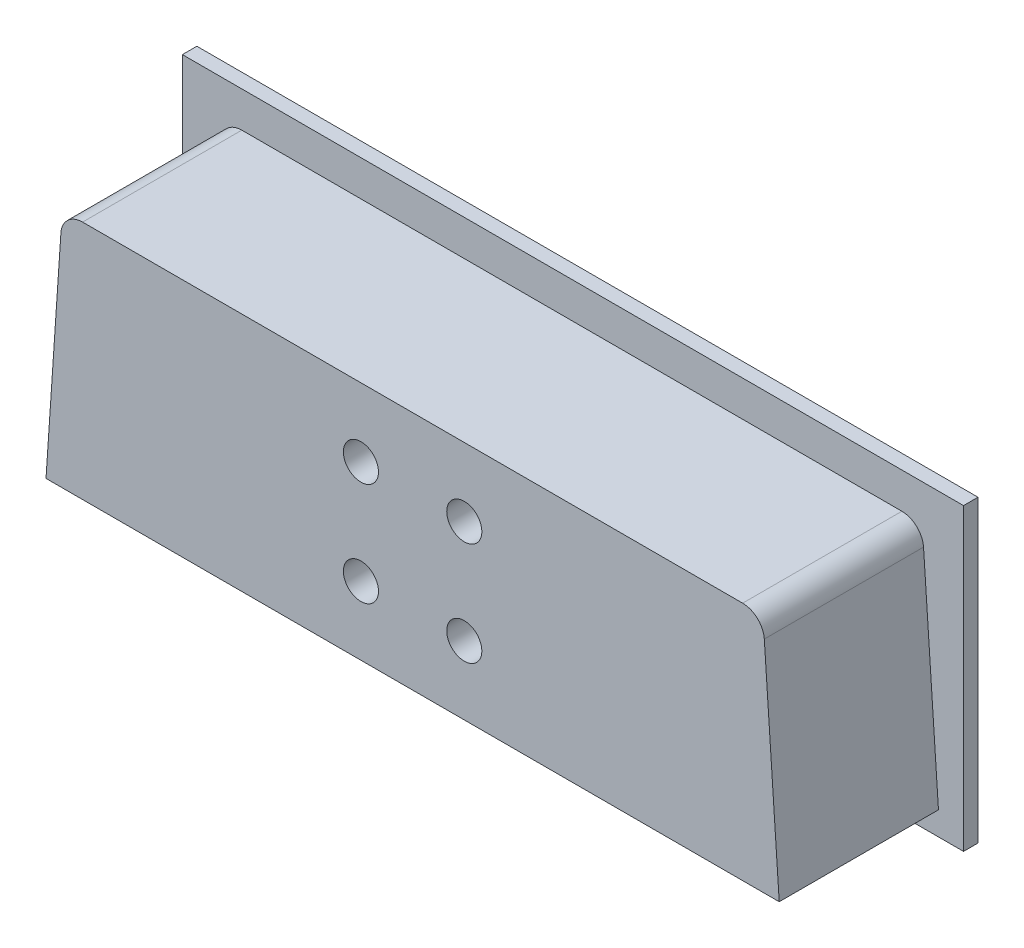
ISO-10303-21;
HEADER;
FILE_DESCRIPTION(('STEP AP214'),'2;1');
FILE_NAME('part.step','',(''),(''),'','','');
FILE_SCHEMA(('AUTOMOTIVE_DESIGN { 1 0 10303 214 1 1 1 1 }'));
ENDSEC;
DATA;
#1=APPLICATION_CONTEXT('core data for automotive mechanical design processes');
#2=APPLICATION_PROTOCOL_DEFINITION('international standard','automotive_design',2000,#1);
#3=PRODUCT_CONTEXT('',#1,'mechanical');
#4=PRODUCT('Part','Part','',(#3));
#5=PRODUCT_RELATED_PRODUCT_CATEGORY('part','',(#4));
#6=PRODUCT_DEFINITION_FORMATION('','',#4);
#7=PRODUCT_DEFINITION_CONTEXT('part definition',#1,'design');
#8=PRODUCT_DEFINITION('design','',#6,#7);
#9=PRODUCT_DEFINITION_SHAPE('','',#8);
#10=(LENGTH_UNIT() NAMED_UNIT(*) SI_UNIT(.MILLI.,.METRE.));
#11=(NAMED_UNIT(*) PLANE_ANGLE_UNIT() SI_UNIT($,.RADIAN.));
#12=(NAMED_UNIT(*) SI_UNIT($,.STERADIAN.) SOLID_ANGLE_UNIT());
#13=UNCERTAINTY_MEASURE_WITH_UNIT(LENGTH_MEASURE(1.E-05),#10,'distance_accuracy_value','');
#14=(GEOMETRIC_REPRESENTATION_CONTEXT(3) GLOBAL_UNCERTAINTY_ASSIGNED_CONTEXT((#13)) GLOBAL_UNIT_ASSIGNED_CONTEXT((#10,
#11,#12)) REPRESENTATION_CONTEXT('',''));
#15=CARTESIAN_POINT('',(0.,0.,0.));
#16=DIRECTION('',(0.,0.,1.));
#17=DIRECTION('',(1.,0.,0.));
#18=AXIS2_PLACEMENT_3D('',#15,#16,#17);
#19=CARTESIAN_POINT('',(0.,0.,22.));
#20=DIRECTION('',(0.997711420500141,-0.0676159848230516,0.));
#21=DIRECTION('',(0.0676159848230516,0.997711420500141,0.));
#22=AXIS2_PLACEMENT_3D('',#19,#20,#21);
#23=PLANE('',#22);
#24=DIRECTION('',(-0.0676159848230516,-0.997711420500141,0.));
#25=VECTOR('',#24,1.);
#26=CARTESIAN_POINT('',(0.,0.,22.));
#27=LINE('',#26,#25);
#28=CARTESIAN_POINT('',(2.06043397281794,30.4028479544692,22.));
#29=VERTEX_POINT('',#28);
#30=CARTESIAN_POINT('',(0.,0.,22.));
#31=VERTEX_POINT('',#30);
#32=EDGE_CURVE('E158',#29,#31,#27,.T.);
#33=ORIENTED_EDGE('',*,*,#32,.F.);
#34=DIRECTION('',(0.,0.,-1.));
#35=VECTOR('',#34,1.);
#36=CARTESIAN_POINT('',(2.06043397281793,30.4028479544692,22.));
#37=LINE('',#36,#35);
#38=CARTESIAN_POINT('',(2.06043397281794,30.4028479544692,0.));
#39=VERTEX_POINT('',#38);
#40=EDGE_CURVE('E187',#29,#39,#37,.T.);
#41=ORIENTED_EDGE('',*,*,#40,.T.);
#42=DIRECTION('',(-0.0676159848230516,-0.997711420500141,0.));
#43=VECTOR('',#42,1.);
#44=CARTESIAN_POINT('',(0.,0.,0.));
#45=LINE('',#44,#43);
#46=CARTESIAN_POINT('',(0.,0.,0.));
#47=VERTEX_POINT('',#46);
#48=EDGE_CURVE('E147',#39,#47,#45,.T.);
#49=ORIENTED_EDGE('',*,*,#48,.T.);
#50=DIRECTION('',(0.,0.,-1.));
#51=VECTOR('',#50,1.);
#52=CARTESIAN_POINT('',(0.,0.,22.));
#53=LINE('',#52,#51);
#54=EDGE_CURVE('E183',#31,#47,#53,.T.);
#55=ORIENTED_EDGE('',*,*,#54,.F.);
#56=EDGE_LOOP('',(#33,#41,#49,#55));
#57=FACE_BOUND('',#56,.T.);
#58=ADVANCED_FACE('F39',(#57),#23,.F.);
#59=CARTESIAN_POINT('',(0.,0.,22.));
#60=DIRECTION('',(0.,1.,0.));
#61=DIRECTION('',(0.,0.,1.));
#62=AXIS2_PLACEMENT_3D('',#59,#60,#61);
#63=PLANE('',#62);
#64=DIRECTION('',(1.,0.,0.));
#65=VECTOR('',#64,1.);
#66=CARTESIAN_POINT('',(0.,0.,0.));
#67=LINE('',#66,#65);
#68=CARTESIAN_POINT('',(101.3,0.,0.));
#69=VERTEX_POINT('',#68);
#70=EDGE_CURVE('E152',#47,#69,#67,.T.);
#71=ORIENTED_EDGE('',*,*,#70,.T.);
#72=DIRECTION('',(0.,0.,-1.));
#73=VECTOR('',#72,1.);
#74=CARTESIAN_POINT('',(101.3,0.,22.));
#75=LINE('',#74,#73);
#76=CARTESIAN_POINT('',(101.3,0.,22.));
#77=VERTEX_POINT('',#76);
#78=EDGE_CURVE('E170',#77,#69,#75,.T.);
#79=ORIENTED_EDGE('',*,*,#78,.F.);
#80=DIRECTION('',(1.,0.,0.));
#81=VECTOR('',#80,1.);
#82=CARTESIAN_POINT('',(0.,0.,22.));
#83=LINE('',#82,#81);
#84=EDGE_CURVE('E161',#31,#77,#83,.T.);
#85=ORIENTED_EDGE('',*,*,#84,.F.);
#86=ORIENTED_EDGE('',*,*,#54,.T.);
#87=EDGE_LOOP('',(#71,#79,#85,#86));
#88=FACE_BOUND('',#87,.T.);
#89=ADVANCED_FACE('F228',(#88),#63,.F.);
#90=CARTESIAN_POINT('',(101.3,0.,22.));
#91=DIRECTION('',(-0.997711420500141,-0.0676159848230517,0.));
#92=DIRECTION('',(0.0676159848230517,-0.997711420500141,0.));
#93=AXIS2_PLACEMENT_3D('',#90,#91,#92);
#94=PLANE('',#93);
#95=DIRECTION('',(-0.0676159848230517,0.997711420500141,0.));
#96=VECTOR('',#95,1.);
#97=CARTESIAN_POINT('',(101.3,0.,0.));
#98=LINE('',#97,#96);
#99=CARTESIAN_POINT('',(99.2395660271821,30.4028479544692,0.));
#100=VERTEX_POINT('',#99);
#101=EDGE_CURVE('E175',#69,#100,#98,.T.);
#102=ORIENTED_EDGE('',*,*,#101,.T.);
#103=DIRECTION('',(0.,0.,-1.));
#104=VECTOR('',#103,1.);
#105=CARTESIAN_POINT('',(99.2395660271821,30.4028479544692,22.));
#106=LINE('',#105,#104);
#107=CARTESIAN_POINT('',(99.2395660271821,30.4028479544692,22.));
#108=VERTEX_POINT('',#107);
#109=EDGE_CURVE('E11',#100,#108,#106,.F.);
#110=ORIENTED_EDGE('',*,*,#109,.T.);
#111=DIRECTION('',(-0.0676159848230517,0.997711420500141,0.));
#112=VECTOR('',#111,1.);
#113=CARTESIAN_POINT('',(101.3,0.,22.));
#114=LINE('',#113,#112);
#115=EDGE_CURVE('E165',#77,#108,#114,.T.);
#116=ORIENTED_EDGE('',*,*,#115,.F.);
#117=ORIENTED_EDGE('',*,*,#78,.T.);
#118=EDGE_LOOP('',(#102,#110,#116,#117));
#119=FACE_BOUND('',#118,.T.);
#120=ADVANCED_FACE('F225',(#119),#94,.F.);
#121=CARTESIAN_POINT('',(2.25,33.2,22.));
#122=DIRECTION('',(0.,-1.,0.));
#123=DIRECTION('',(1.,0.,0.));
#124=AXIS2_PLACEMENT_3D('',#121,#122,#123);
#125=PLANE('',#124);
#126=DIRECTION('',(-1.,0.,0.));
#127=VECTOR('',#126,1.);
#128=CARTESIAN_POINT('',(2.25,33.2,0.));
#129=LINE('',#128,#127);
#130=CARTESIAN_POINT('',(96.2464317656816,33.2,0.));
#131=VERTEX_POINT('',#130);
#132=CARTESIAN_POINT('',(5.05356823431836,33.2,0.));
#133=VERTEX_POINT('',#132);
#134=EDGE_CURVE('E162',#131,#133,#129,.T.);
#135=ORIENTED_EDGE('',*,*,#134,.T.);
#136=DIRECTION('',(0.,0.,-1.));
#137=VECTOR('',#136,1.);
#138=CARTESIAN_POINT('',(5.05356823431836,33.2,22.));
#139=LINE('',#138,#137);
#140=CARTESIAN_POINT('',(5.05356823431836,33.2,22.));
#141=VERTEX_POINT('',#140);
#142=EDGE_CURVE('E61',#133,#141,#139,.F.);
#143=ORIENTED_EDGE('',*,*,#142,.T.);
#144=DIRECTION('',(-1.,0.,0.));
#145=VECTOR('',#144,1.);
#146=CARTESIAN_POINT('',(2.25,33.2,22.));
#147=LINE('',#146,#145);
#148=CARTESIAN_POINT('',(96.2464317656816,33.2,22.));
#149=VERTEX_POINT('',#148);
#150=EDGE_CURVE('E168',#149,#141,#147,.T.);
#151=ORIENTED_EDGE('',*,*,#150,.F.);
#152=DIRECTION('',(0.,0.,-1.));
#153=VECTOR('',#152,1.);
#154=CARTESIAN_POINT('',(96.2464317656816,33.2,22.));
#155=LINE('',#154,#153);
#156=EDGE_CURVE('E197',#149,#131,#155,.T.);
#157=ORIENTED_EDGE('',*,*,#156,.T.);
#158=EDGE_LOOP('',(#135,#143,#151,#157));
#159=FACE_BOUND('',#158,.T.);
#160=ADVANCED_FACE('F221',(#159),#125,.F.);
#161=CARTESIAN_POINT('',(0.,0.,22.));
#162=DIRECTION('',(0.,0.,-1.));
#163=DIRECTION('',(-1.,0.,0.));
#164=AXIS2_PLACEMENT_3D('',#161,#162,#163);
#165=PLANE('',#164);
#166=CARTESIAN_POINT('',(43.51,9.45500000000001,22.));
#167=DIRECTION('',(0.,0.,1.));
#168=DIRECTION('',(-1.,0.,0.));
#169=AXIS2_PLACEMENT_3D('',#166,#167,#168);
#170=CIRCLE('',#169,2.425);
#171=CARTESIAN_POINT('',(41.085,9.45500000000001,22.));
#172=VERTEX_POINT('',#171);
#173=EDGE_CURVE('E320',#172,#172,#170,.T.);
#174=ORIENTED_EDGE('',*,*,#173,.F.);
#175=EDGE_LOOP('',(#174));
#176=FACE_BOUND('',#175,.T.);
#177=CARTESIAN_POINT('',(57.79,23.735,22.));
#178=DIRECTION('',(0.,0.,1.));
#179=DIRECTION('',(-1.,0.,0.));
#180=AXIS2_PLACEMENT_3D('',#177,#178,#179);
#181=CIRCLE('',#180,2.425);
#182=CARTESIAN_POINT('',(55.365,23.735,22.));
#183=VERTEX_POINT('',#182);
#184=EDGE_CURVE('E304',#183,#183,#181,.T.);
#185=ORIENTED_EDGE('',*,*,#184,.F.);
#186=EDGE_LOOP('',(#185));
#187=FACE_BOUND('',#186,.T.);
#188=CARTESIAN_POINT('',(43.51,23.735,22.));
#189=DIRECTION('',(0.,0.,1.));
#190=DIRECTION('',(1.,0.,0.));
#191=AXIS2_PLACEMENT_3D('',#188,#189,#190);
#192=CIRCLE('',#191,2.425);
#193=CARTESIAN_POINT('',(45.935,23.735,22.));
#194=VERTEX_POINT('',#193);
#195=EDGE_CURVE('E305',#194,#194,#192,.T.);
#196=ORIENTED_EDGE('',*,*,#195,.F.);
#197=EDGE_LOOP('',(#196));
#198=FACE_BOUND('',#197,.T.);
#199=CARTESIAN_POINT('',(57.79,9.45500000000001,22.));
#200=DIRECTION('',(0.,0.,1.));
#201=DIRECTION('',(1.,0.,0.));
#202=AXIS2_PLACEMENT_3D('',#199,#200,#201);
#203=CIRCLE('',#202,2.425);
#204=CARTESIAN_POINT('',(60.215,9.45500000000001,22.));
#205=VERTEX_POINT('',#204);
#206=EDGE_CURVE('E319',#205,#205,#203,.T.);
#207=ORIENTED_EDGE('',*,*,#206,.F.);
#208=EDGE_LOOP('',(#207));
#209=FACE_BOUND('',#208,.T.);
#210=ORIENTED_EDGE('',*,*,#150,.T.);
#211=CARTESIAN_POINT('',(5.05356823431836,30.2,22.));
#212=DIRECTION('',(0.,0.,-1.));
#213=DIRECTION('',(-1.,0.,0.));
#214=AXIS2_PLACEMENT_3D('',#211,#212,#213);
#215=CIRCLE('',#214,3.);
#216=EDGE_CURVE('E48',#141,#29,#215,.F.);
#217=ORIENTED_EDGE('',*,*,#216,.T.);
#218=ORIENTED_EDGE('',*,*,#32,.T.);
#219=ORIENTED_EDGE('',*,*,#84,.T.);
#220=ORIENTED_EDGE('',*,*,#115,.T.);
#221=CARTESIAN_POINT('',(96.2464317656816,30.2,22.));
#222=DIRECTION('',(0.,0.,-1.));
#223=DIRECTION('',(-1.,0.,0.));
#224=AXIS2_PLACEMENT_3D('',#221,#222,#223);
#225=CIRCLE('',#224,3.);
#226=EDGE_CURVE('E203',#108,#149,#225,.F.);
#227=ORIENTED_EDGE('',*,*,#226,.T.);
#228=EDGE_LOOP('',(#210,#217,#218,#219,#220,#227));
#229=FACE_BOUND('',#228,.T.);
#230=ADVANCED_FACE('F209',(#176,#187,#198,#209,#229),#165,.F.);
#231=CARTESIAN_POINT('',(5.05356823431836,30.2,22.));
#232=DIRECTION('',(0.,0.,-1.));
#233=DIRECTION('',(-1.,0.,0.));
#234=AXIS2_PLACEMENT_3D('',#231,#232,#233);
#235=CYLINDRICAL_SURFACE('',#234,3.);
#236=ORIENTED_EDGE('',*,*,#216,.F.);
#237=ORIENTED_EDGE('',*,*,#142,.F.);
#238=CARTESIAN_POINT('',(5.05356823431836,30.2,0.));
#239=DIRECTION('',(0.,0.,-1.));
#240=DIRECTION('',(-1.,0.,0.));
#241=AXIS2_PLACEMENT_3D('',#238,#239,#240);
#242=CIRCLE('',#241,3.);
#243=EDGE_CURVE('E194',#39,#133,#242,.T.);
#244=ORIENTED_EDGE('',*,*,#243,.F.);
#245=ORIENTED_EDGE('',*,*,#40,.F.);
#246=EDGE_LOOP('',(#236,#237,#244,#245));
#247=FACE_BOUND('',#246,.T.);
#248=ADVANCED_FACE('F216',(#247),#235,.T.);
#249=CARTESIAN_POINT('',(96.2464317656816,30.2,22.));
#250=DIRECTION('',(0.,0.,-1.));
#251=DIRECTION('',(-1.,0.,0.));
#252=AXIS2_PLACEMENT_3D('',#249,#250,#251);
#253=CYLINDRICAL_SURFACE('',#252,3.);
#254=ORIENTED_EDGE('',*,*,#226,.F.);
#255=ORIENTED_EDGE('',*,*,#109,.F.);
#256=CARTESIAN_POINT('',(96.2464317656816,30.2,0.));
#257=DIRECTION('',(0.,0.,-1.));
#258=DIRECTION('',(-1.,0.,0.));
#259=AXIS2_PLACEMENT_3D('',#256,#257,#258);
#260=CIRCLE('',#259,3.);
#261=EDGE_CURVE('E191',#131,#100,#260,.T.);
#262=ORIENTED_EDGE('',*,*,#261,.F.);
#263=ORIENTED_EDGE('',*,*,#156,.F.);
#264=EDGE_LOOP('',(#254,#255,#262,#263));
#265=FACE_BOUND('',#264,.T.);
#266=ADVANCED_FACE('F41',(#265),#253,.T.);
#267=CARTESIAN_POINT('',(104.763342239961,38.1357617971895,-2.));
#268=DIRECTION('',(-1.,0.,0.));
#269=DIRECTION('',(0.,0.,1.));
#270=AXIS2_PLACEMENT_3D('',#267,#268,#269);
#271=PLANE('',#270);
#272=DIRECTION('',(0.,-1.,0.));
#273=VECTOR('',#272,1.);
#274=CARTESIAN_POINT('',(104.763342239961,38.1357617971895,0.));
#275=LINE('',#274,#273);
#276=CARTESIAN_POINT('',(104.763342239961,38.1357617971895,0.));
#277=VERTEX_POINT('',#276);
#278=CARTESIAN_POINT('',(104.763342239961,-3.24502932748656,0.));
#279=VERTEX_POINT('',#278);
#280=EDGE_CURVE('E145',#277,#279,#275,.T.);
#281=ORIENTED_EDGE('',*,*,#280,.T.);
#282=DIRECTION('',(0.,0.,1.));
#283=VECTOR('',#282,1.);
#284=CARTESIAN_POINT('',(104.763342239961,-3.24502932748656,-2.));
#285=LINE('',#284,#283);
#286=CARTESIAN_POINT('',(104.763342239961,-3.24502932748656,-2.));
#287=VERTEX_POINT('',#286);
#288=EDGE_CURVE('E123',#287,#279,#285,.T.);
#289=ORIENTED_EDGE('',*,*,#288,.F.);
#290=DIRECTION('',(0.,-1.,0.));
#291=VECTOR('',#290,1.);
#292=CARTESIAN_POINT('',(104.763342239961,38.1357617971895,-2.));
#293=LINE('',#292,#291);
#294=CARTESIAN_POINT('',(104.763342239961,38.1357617971895,-2.));
#295=VERTEX_POINT('',#294);
#296=EDGE_CURVE('E131',#295,#287,#293,.T.);
#297=ORIENTED_EDGE('',*,*,#296,.F.);
#298=DIRECTION('',(0.,0.,1.));
#299=VECTOR('',#298,1.);
#300=CARTESIAN_POINT('',(104.763342239961,38.1357617971895,-2.));
#301=LINE('',#300,#299);
#302=EDGE_CURVE('E338',#295,#277,#301,.T.);
#303=ORIENTED_EDGE('',*,*,#302,.T.);
#304=EDGE_LOOP('',(#281,#289,#297,#303));
#305=FACE_BOUND('',#304,.T.);
#306=ADVANCED_FACE('F143',(#305),#271,.F.);
#307=CARTESIAN_POINT('',(104.763342239961,-3.24502932748656,-2.));
#308=DIRECTION('',(0.,1.,0.));
#309=DIRECTION('',(0.,0.,1.));
#310=AXIS2_PLACEMENT_3D('',#307,#308,#309);
#311=PLANE('',#310);
#312=DIRECTION('',(-1.,0.,0.));
#313=VECTOR('',#312,1.);
#314=CARTESIAN_POINT('',(104.763342239961,-3.24502932748656,0.));
#315=LINE('',#314,#313);
#316=CARTESIAN_POINT('',(-3.15529664846212,-3.24502932748656,0.));
#317=VERTEX_POINT('',#316);
#318=EDGE_CURVE('E341',#279,#317,#315,.T.);
#319=ORIENTED_EDGE('',*,*,#318,.T.);
#320=DIRECTION('',(0.,0.,1.));
#321=VECTOR('',#320,1.);
#322=CARTESIAN_POINT('',(-3.15529664846212,-3.24502932748656,-2.));
#323=LINE('',#322,#321);
#324=CARTESIAN_POINT('',(-3.15529664846212,-3.24502932748656,-2.));
#325=VERTEX_POINT('',#324);
#326=EDGE_CURVE('E126',#325,#317,#323,.T.);
#327=ORIENTED_EDGE('',*,*,#326,.F.);
#328=DIRECTION('',(-1.,0.,0.));
#329=VECTOR('',#328,1.);
#330=CARTESIAN_POINT('',(104.763342239961,-3.24502932748656,-2.));
#331=LINE('',#330,#329);
#332=EDGE_CURVE('E119',#287,#325,#331,.T.);
#333=ORIENTED_EDGE('',*,*,#332,.F.);
#334=ORIENTED_EDGE('',*,*,#288,.T.);
#335=EDGE_LOOP('',(#319,#327,#333,#334));
#336=FACE_BOUND('',#335,.T.);
#337=ADVANCED_FACE('F121',(#336),#311,.F.);
#338=CARTESIAN_POINT('',(-3.15529664846212,38.1357617971895,-2.));
#339=DIRECTION('',(1.,0.,0.));
#340=DIRECTION('',(0.,0.,-1.));
#341=AXIS2_PLACEMENT_3D('',#338,#339,#340);
#342=PLANE('',#341);
#343=DIRECTION('',(0.,1.,0.));
#344=VECTOR('',#343,1.);
#345=CARTESIAN_POINT('',(-3.15529664846212,38.1357617971895,0.));
#346=LINE('',#345,#344);
#347=CARTESIAN_POINT('',(-3.15529664846212,38.1357617971895,0.));
#348=VERTEX_POINT('',#347);
#349=EDGE_CURVE('E344',#317,#348,#346,.T.);
#350=ORIENTED_EDGE('',*,*,#349,.T.);
#351=DIRECTION('',(0.,0.,1.));
#352=VECTOR('',#351,1.);
#353=CARTESIAN_POINT('',(-3.15529664846212,38.1357617971895,-2.));
#354=LINE('',#353,#352);
#355=CARTESIAN_POINT('',(-3.15529664846212,38.1357617971895,-2.));
#356=VERTEX_POINT('',#355);
#357=EDGE_CURVE('E154',#356,#348,#354,.T.);
#358=ORIENTED_EDGE('',*,*,#357,.F.);
#359=DIRECTION('',(0.,1.,0.));
#360=VECTOR('',#359,1.);
#361=CARTESIAN_POINT('',(-3.15529664846212,38.1357617971895,-2.));
#362=LINE('',#361,#360);
#363=EDGE_CURVE('E130',#325,#356,#362,.T.);
#364=ORIENTED_EDGE('',*,*,#363,.F.);
#365=ORIENTED_EDGE('',*,*,#326,.T.);
#366=EDGE_LOOP('',(#350,#358,#364,#365));
#367=FACE_BOUND('',#366,.T.);
#368=ADVANCED_FACE('F255',(#367),#342,.F.);
#369=CARTESIAN_POINT('',(104.763342239961,38.1357617971895,-2.));
#370=DIRECTION('',(0.,-1.,0.));
#371=DIRECTION('',(0.,0.,-1.));
#372=AXIS2_PLACEMENT_3D('',#369,#370,#371);
#373=PLANE('',#372);
#374=DIRECTION('',(1.,0.,0.));
#375=VECTOR('',#374,1.);
#376=CARTESIAN_POINT('',(104.763342239961,38.1357617971895,0.));
#377=LINE('',#376,#375);
#378=EDGE_CURVE('E141',#348,#277,#377,.T.);
#379=ORIENTED_EDGE('',*,*,#378,.T.);
#380=ORIENTED_EDGE('',*,*,#302,.F.);
#381=DIRECTION('',(1.,0.,0.));
#382=VECTOR('',#381,1.);
#383=CARTESIAN_POINT('',(104.763342239961,38.1357617971895,-2.));
#384=LINE('',#383,#382);
#385=EDGE_CURVE('E136',#356,#295,#384,.T.);
#386=ORIENTED_EDGE('',*,*,#385,.F.);
#387=ORIENTED_EDGE('',*,*,#357,.T.);
#388=EDGE_LOOP('',(#379,#380,#386,#387));
#389=FACE_BOUND('',#388,.T.);
#390=ADVANCED_FACE('F258',(#389),#373,.F.);
#391=CARTESIAN_POINT('',(0.,0.,-2.));
#392=DIRECTION('',(0.,0.,-1.));
#393=DIRECTION('',(-1.,0.,0.));
#394=AXIS2_PLACEMENT_3D('',#391,#392,#393);
#395=PLANE('',#394);
#396=ORIENTED_EDGE('',*,*,#296,.T.);
#397=ORIENTED_EDGE('',*,*,#332,.T.);
#398=ORIENTED_EDGE('',*,*,#363,.T.);
#399=ORIENTED_EDGE('',*,*,#385,.T.);
#400=EDGE_LOOP('',(#396,#397,#398,#399));
#401=FACE_BOUND('',#400,.T.);
#402=ADVANCED_FACE('F134',(#401),#395,.T.);
#403=CARTESIAN_POINT('',(0.,0.,0.));
#404=DIRECTION('',(0.,0.,-1.));
#405=DIRECTION('',(-1.,0.,0.));
#406=AXIS2_PLACEMENT_3D('',#403,#404,#405);
#407=PLANE('',#406);
#408=ORIENTED_EDGE('',*,*,#48,.F.);
#409=ORIENTED_EDGE('',*,*,#243,.T.);
#410=ORIENTED_EDGE('',*,*,#134,.F.);
#411=ORIENTED_EDGE('',*,*,#261,.T.);
#412=ORIENTED_EDGE('',*,*,#101,.F.);
#413=ORIENTED_EDGE('',*,*,#70,.F.);
#414=EDGE_LOOP('',(#408,#409,#410,#411,#412,#413));
#415=FACE_BOUND('',#414,.T.);
#416=ORIENTED_EDGE('',*,*,#280,.F.);
#417=ORIENTED_EDGE('',*,*,#378,.F.);
#418=ORIENTED_EDGE('',*,*,#349,.F.);
#419=ORIENTED_EDGE('',*,*,#318,.F.);
#420=EDGE_LOOP('',(#416,#417,#418,#419));
#421=FACE_BOUND('',#420,.T.);
#422=ADVANCED_FACE('F218',(#415,#421),#407,.F.);
#423=CARTESIAN_POINT('',(57.79,9.45500000000001,13.5));
#424=DIRECTION('',(0.,0.,1.));
#425=DIRECTION('',(1.,0.,0.));
#426=AXIS2_PLACEMENT_3D('',#423,#424,#425);
#427=CYLINDRICAL_SURFACE('',#426,2.425);
#428=CARTESIAN_POINT('',(57.79,9.45500000000001,13.5));
#429=DIRECTION('',(0.,0.,1.));
#430=DIRECTION('',(1.,0.,0.));
#431=AXIS2_PLACEMENT_3D('',#428,#429,#430);
#432=CIRCLE('',#431,2.425);
#433=CARTESIAN_POINT('',(60.215,9.45500000000001,13.5));
#434=VERTEX_POINT('',#433);
#435=EDGE_CURVE('E327',#434,#434,#432,.T.);
#436=ORIENTED_EDGE('',*,*,#435,.F.);
#437=EDGE_LOOP('',(#436));
#438=FACE_BOUND('',#437,.T.);
#439=ORIENTED_EDGE('',*,*,#206,.T.);
#440=EDGE_LOOP('',(#439));
#441=FACE_BOUND('',#440,.T.);
#442=ADVANCED_FACE('F265',(#438,#441),#427,.F.);
#443=CARTESIAN_POINT('',(57.79,9.45500000000001,13.5));
#444=DIRECTION('',(0.,0.,1.));
#445=DIRECTION('',(1.,0.,0.));
#446=AXIS2_PLACEMENT_3D('',#443,#444,#445);
#447=PLANE('',#446);
#448=ORIENTED_EDGE('',*,*,#435,.T.);
#449=EDGE_LOOP('',(#448));
#450=FACE_BOUND('',#449,.T.);
#451=ADVANCED_FACE('F270',(#450),#447,.T.);
#452=CARTESIAN_POINT('',(43.51,23.735,13.5));
#453=DIRECTION('',(0.,0.,1.));
#454=DIRECTION('',(1.,0.,0.));
#455=AXIS2_PLACEMENT_3D('',#452,#453,#454);
#456=CYLINDRICAL_SURFACE('',#455,2.425);
#457=CARTESIAN_POINT('',(43.51,23.735,13.5));
#458=DIRECTION('',(0.,0.,1.));
#459=DIRECTION('',(1.,0.,0.));
#460=AXIS2_PLACEMENT_3D('',#457,#458,#459);
#461=CIRCLE('',#460,2.425);
#462=CARTESIAN_POINT('',(45.935,23.735,13.5));
#463=VERTEX_POINT('',#462);
#464=EDGE_CURVE('E302',#463,#463,#461,.T.);
#465=ORIENTED_EDGE('',*,*,#464,.F.);
#466=EDGE_LOOP('',(#465));
#467=FACE_BOUND('',#466,.T.);
#468=ORIENTED_EDGE('',*,*,#195,.T.);
#469=EDGE_LOOP('',(#468));
#470=FACE_BOUND('',#469,.T.);
#471=ADVANCED_FACE('F274',(#467,#470),#456,.F.);
#472=CARTESIAN_POINT('',(43.51,23.735,13.5));
#473=DIRECTION('',(0.,0.,1.));
#474=DIRECTION('',(1.,0.,0.));
#475=AXIS2_PLACEMENT_3D('',#472,#473,#474);
#476=PLANE('',#475);
#477=ORIENTED_EDGE('',*,*,#464,.T.);
#478=EDGE_LOOP('',(#477));
#479=FACE_BOUND('',#478,.T.);
#480=ADVANCED_FACE('F280',(#479),#476,.T.);
#481=CARTESIAN_POINT('',(57.79,23.735,13.5));
#482=DIRECTION('',(0.,0.,1.));
#483=DIRECTION('',(1.,0.,0.));
#484=AXIS2_PLACEMENT_3D('',#481,#482,#483);
#485=CYLINDRICAL_SURFACE('',#484,2.425);
#486=CARTESIAN_POINT('',(57.79,23.735,13.5));
#487=DIRECTION('',(0.,0.,1.));
#488=DIRECTION('',(-1.,0.,0.));
#489=AXIS2_PLACEMENT_3D('',#486,#487,#488);
#490=CIRCLE('',#489,2.425);
#491=CARTESIAN_POINT('',(55.365,23.735,13.5));
#492=VERTEX_POINT('',#491);
#493=EDGE_CURVE('E310',#492,#492,#490,.T.);
#494=ORIENTED_EDGE('',*,*,#493,.F.);
#495=EDGE_LOOP('',(#494));
#496=FACE_BOUND('',#495,.T.);
#497=ORIENTED_EDGE('',*,*,#184,.T.);
#498=EDGE_LOOP('',(#497));
#499=FACE_BOUND('',#498,.T.);
#500=ADVANCED_FACE('F276',(#496,#499),#485,.F.);
#501=CARTESIAN_POINT('',(57.79,23.735,13.5));
#502=DIRECTION('',(0.,0.,-1.));
#503=DIRECTION('',(-1.,0.,0.));
#504=AXIS2_PLACEMENT_3D('',#501,#502,#503);
#505=PLANE('',#504);
#506=ORIENTED_EDGE('',*,*,#493,.T.);
#507=EDGE_LOOP('',(#506));
#508=FACE_BOUND('',#507,.T.);
#509=ADVANCED_FACE('F279',(#508),#505,.F.);
#510=CARTESIAN_POINT('',(43.51,9.45500000000001,13.5));
#511=DIRECTION('',(0.,0.,1.));
#512=DIRECTION('',(1.,0.,0.));
#513=AXIS2_PLACEMENT_3D('',#510,#511,#512);
#514=CYLINDRICAL_SURFACE('',#513,2.425);
#515=CARTESIAN_POINT('',(43.51,9.45500000000001,13.5));
#516=DIRECTION('',(0.,0.,1.));
#517=DIRECTION('',(-1.,0.,0.));
#518=AXIS2_PLACEMENT_3D('',#515,#516,#517);
#519=CIRCLE('',#518,2.425);
#520=CARTESIAN_POINT('',(41.085,9.45500000000001,13.5));
#521=VERTEX_POINT('',#520);
#522=EDGE_CURVE('E315',#521,#521,#519,.T.);
#523=ORIENTED_EDGE('',*,*,#522,.F.);
#524=EDGE_LOOP('',(#523));
#525=FACE_BOUND('',#524,.T.);
#526=ORIENTED_EDGE('',*,*,#173,.T.);
#527=EDGE_LOOP('',(#526));
#528=FACE_BOUND('',#527,.T.);
#529=ADVANCED_FACE('F284',(#525,#528),#514,.F.);
#530=CARTESIAN_POINT('',(43.51,9.45500000000001,13.5));
#531=DIRECTION('',(0.,0.,-1.));
#532=DIRECTION('',(-1.,0.,0.));
#533=AXIS2_PLACEMENT_3D('',#530,#531,#532);
#534=PLANE('',#533);
#535=ORIENTED_EDGE('',*,*,#522,.T.);
#536=EDGE_LOOP('',(#535));
#537=FACE_BOUND('',#536,.T.);
#538=ADVANCED_FACE('F288',(#537),#534,.F.);
#539=CLOSED_SHELL('',(#58,#89,#120,#160,#230,#248,#266,#306,#337,#368,#390,#402,#422,#442,#451,
#471,#480,#500,#509,#529,#538));
#540=MANIFOLD_SOLID_BREP('B2',#539);
#541=ADVANCED_BREP_SHAPE_REPRESENTATION('',(#18,#540),#14);
#542=SHAPE_DEFINITION_REPRESENTATION(#9,#541);
ENDSEC;
END-ISO-10303-21;
